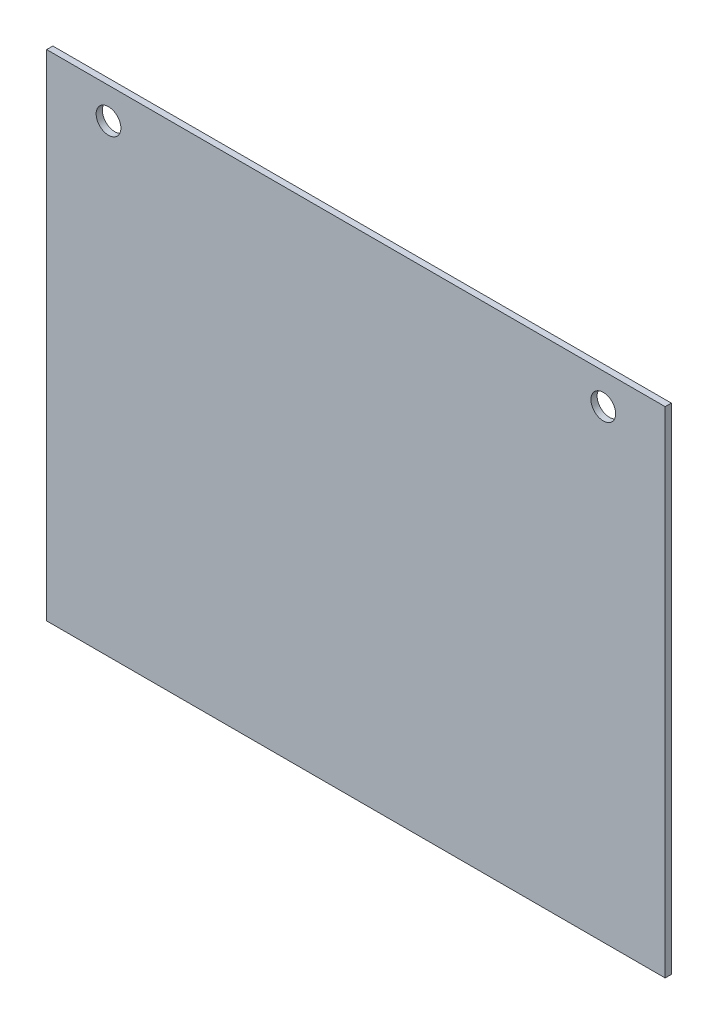
ISO-10303-21;
HEADER;
FILE_DESCRIPTION(('STEP AP214'),'2;1');
FILE_NAME('part.step','',(''),(''),'','','');
FILE_SCHEMA(('AUTOMOTIVE_DESIGN { 1 0 10303 214 1 1 1 1 }'));
ENDSEC;
DATA;
#1=APPLICATION_CONTEXT('core data for automotive mechanical design processes');
#2=APPLICATION_PROTOCOL_DEFINITION('international standard','automotive_design',2000,#1);
#3=PRODUCT_CONTEXT('',#1,'mechanical');
#4=PRODUCT('Part','Part','',(#3));
#5=PRODUCT_RELATED_PRODUCT_CATEGORY('part','',(#4));
#6=PRODUCT_DEFINITION_FORMATION('','',#4);
#7=PRODUCT_DEFINITION_CONTEXT('part definition',#1,'design');
#8=PRODUCT_DEFINITION('design','',#6,#7);
#9=PRODUCT_DEFINITION_SHAPE('','',#8);
#10=(LENGTH_UNIT() NAMED_UNIT(*) SI_UNIT(.MILLI.,.METRE.));
#11=(NAMED_UNIT(*) PLANE_ANGLE_UNIT() SI_UNIT($,.RADIAN.));
#12=(NAMED_UNIT(*) SI_UNIT($,.STERADIAN.) SOLID_ANGLE_UNIT());
#13=UNCERTAINTY_MEASURE_WITH_UNIT(LENGTH_MEASURE(1.E-05),#10,'distance_accuracy_value','');
#14=(GEOMETRIC_REPRESENTATION_CONTEXT(3) GLOBAL_UNCERTAINTY_ASSIGNED_CONTEXT((#13)) GLOBAL_UNIT_ASSIGNED_CONTEXT((#10,
#11,#12)) REPRESENTATION_CONTEXT('',''));
#15=CARTESIAN_POINT('',(0.,0.,0.));
#16=DIRECTION('',(0.,0.,1.));
#17=DIRECTION('',(1.,0.,0.));
#18=AXIS2_PLACEMENT_3D('',#15,#16,#17);
#19=CARTESIAN_POINT('',(-50.,80.,1.));
#20=DIRECTION('',(0.,0.,-1.));
#21=DIRECTION('',(-1.,0.,0.));
#22=AXIS2_PLACEMENT_3D('',#19,#20,#21);
#23=PLANE('',#22);
#24=CARTESIAN_POINT('',(40.,75.,1.));
#25=DIRECTION('',(0.,0.,1.));
#26=DIRECTION('',(1.,0.,0.));
#27=AXIS2_PLACEMENT_3D('',#24,#25,#26);
#28=CIRCLE('',#27,2.);
#29=CARTESIAN_POINT('',(42.,75.,1.));
#30=VERTEX_POINT('',#29);
#31=EDGE_CURVE('E119',#30,#30,#28,.T.);
#32=ORIENTED_EDGE('',*,*,#31,.F.);
#33=EDGE_LOOP('',(#32));
#34=FACE_BOUND('',#33,.T.);
#35=CARTESIAN_POINT('',(-40.,75.,1.));
#36=DIRECTION('',(0.,0.,1.));
#37=DIRECTION('',(1.,0.,0.));
#38=AXIS2_PLACEMENT_3D('',#35,#36,#37);
#39=CIRCLE('',#38,2.);
#40=CARTESIAN_POINT('',(-38.,75.,1.));
#41=VERTEX_POINT('',#40);
#42=EDGE_CURVE('E113',#41,#41,#39,.T.);
#43=ORIENTED_EDGE('',*,*,#42,.F.);
#44=EDGE_LOOP('',(#43));
#45=FACE_BOUND('',#44,.T.);
#46=DIRECTION('',(1.,0.,0.));
#47=VECTOR('',#46,1.);
#48=CARTESIAN_POINT('',(-50.,0.,1.));
#49=LINE('',#48,#47);
#50=CARTESIAN_POINT('',(-50.,0.,1.));
#51=VERTEX_POINT('',#50);
#52=CARTESIAN_POINT('',(50.,0.,1.));
#53=VERTEX_POINT('',#52);
#54=EDGE_CURVE('E101',#51,#53,#49,.T.);
#55=ORIENTED_EDGE('',*,*,#54,.T.);
#56=DIRECTION('',(0.,-1.,0.));
#57=VECTOR('',#56,1.);
#58=CARTESIAN_POINT('',(50.,80.,1.));
#59=LINE('',#58,#57);
#60=CARTESIAN_POINT('',(50.,80.,1.));
#61=VERTEX_POINT('',#60);
#62=EDGE_CURVE('E11',#61,#53,#59,.T.);
#63=ORIENTED_EDGE('',*,*,#62,.F.);
#64=DIRECTION('',(1.,0.,0.));
#65=VECTOR('',#64,1.);
#66=CARTESIAN_POINT('',(-50.,80.,1.));
#67=LINE('',#66,#65);
#68=CARTESIAN_POINT('',(-50.,80.,1.));
#69=VERTEX_POINT('',#68);
#70=EDGE_CURVE('E78',#69,#61,#67,.T.);
#71=ORIENTED_EDGE('',*,*,#70,.F.);
#72=DIRECTION('',(0.,-1.,0.));
#73=VECTOR('',#72,1.);
#74=CARTESIAN_POINT('',(-50.,80.,1.));
#75=LINE('',#74,#73);
#76=EDGE_CURVE('E54',#69,#51,#75,.T.);
#77=ORIENTED_EDGE('',*,*,#76,.T.);
#78=EDGE_LOOP('',(#55,#63,#71,#77));
#79=FACE_BOUND('',#78,.T.);
#80=ADVANCED_FACE('F38',(#34,#45,#79),#23,.F.);
#81=CARTESIAN_POINT('',(50.,80.,0.));
#82=DIRECTION('',(1.,0.,0.));
#83=DIRECTION('',(0.,0.,-1.));
#84=AXIS2_PLACEMENT_3D('',#81,#82,#83);
#85=PLANE('',#84);
#86=DIRECTION('',(0.,0.,1.));
#87=VECTOR('',#86,1.);
#88=CARTESIAN_POINT('',(50.,0.,0.));
#89=LINE('',#88,#87);
#90=CARTESIAN_POINT('',(50.,0.,0.));
#91=VERTEX_POINT('',#90);
#92=EDGE_CURVE('E87',#91,#53,#89,.T.);
#93=ORIENTED_EDGE('',*,*,#92,.F.);
#94=DIRECTION('',(0.,-1.,0.));
#95=VECTOR('',#94,1.);
#96=CARTESIAN_POINT('',(50.,80.,0.));
#97=LINE('',#96,#95);
#98=CARTESIAN_POINT('',(50.,80.,0.));
#99=VERTEX_POINT('',#98);
#100=EDGE_CURVE('E46',#99,#91,#97,.T.);
#101=ORIENTED_EDGE('',*,*,#100,.F.);
#102=DIRECTION('',(0.,0.,1.));
#103=VECTOR('',#102,1.);
#104=CARTESIAN_POINT('',(50.,80.,0.));
#105=LINE('',#104,#103);
#106=EDGE_CURVE('E85',#99,#61,#105,.T.);
#107=ORIENTED_EDGE('',*,*,#106,.T.);
#108=ORIENTED_EDGE('',*,*,#62,.T.);
#109=EDGE_LOOP('',(#93,#101,#107,#108));
#110=FACE_BOUND('',#109,.T.);
#111=ADVANCED_FACE('F84',(#110),#85,.T.);
#112=CARTESIAN_POINT('',(-50.,80.,0.));
#113=DIRECTION('',(0.,0.,-1.));
#114=DIRECTION('',(-1.,0.,0.));
#115=AXIS2_PLACEMENT_3D('',#112,#113,#114);
#116=PLANE('',#115);
#117=CARTESIAN_POINT('',(40.,75.,0.));
#118=DIRECTION('',(0.,0.,1.));
#119=DIRECTION('',(1.,0.,0.));
#120=AXIS2_PLACEMENT_3D('',#117,#118,#119);
#121=CIRCLE('',#120,2.);
#122=CARTESIAN_POINT('',(42.,75.,0.));
#123=VERTEX_POINT('',#122);
#124=EDGE_CURVE('E103',#123,#123,#121,.T.);
#125=ORIENTED_EDGE('',*,*,#124,.T.);
#126=EDGE_LOOP('',(#125));
#127=FACE_BOUND('',#126,.T.);
#128=CARTESIAN_POINT('',(-40.,75.,0.));
#129=DIRECTION('',(0.,0.,1.));
#130=DIRECTION('',(1.,0.,0.));
#131=AXIS2_PLACEMENT_3D('',#128,#129,#130);
#132=CIRCLE('',#131,2.);
#133=CARTESIAN_POINT('',(-38.,75.,0.));
#134=VERTEX_POINT('',#133);
#135=EDGE_CURVE('E116',#134,#134,#132,.T.);
#136=ORIENTED_EDGE('',*,*,#135,.T.);
#137=EDGE_LOOP('',(#136));
#138=FACE_BOUND('',#137,.T.);
#139=DIRECTION('',(1.,0.,0.));
#140=VECTOR('',#139,1.);
#141=CARTESIAN_POINT('',(-50.,0.,0.));
#142=LINE('',#141,#140);
#143=CARTESIAN_POINT('',(-50.,0.,0.));
#144=VERTEX_POINT('',#143);
#145=EDGE_CURVE('E105',#144,#91,#142,.T.);
#146=ORIENTED_EDGE('',*,*,#145,.F.);
#147=DIRECTION('',(0.,-1.,0.));
#148=VECTOR('',#147,1.);
#149=CARTESIAN_POINT('',(-50.,80.,0.));
#150=LINE('',#149,#148);
#151=CARTESIAN_POINT('',(-50.,80.,0.));
#152=VERTEX_POINT('',#151);
#153=EDGE_CURVE('E67',#152,#144,#150,.T.);
#154=ORIENTED_EDGE('',*,*,#153,.F.);
#155=DIRECTION('',(1.,0.,0.));
#156=VECTOR('',#155,1.);
#157=CARTESIAN_POINT('',(-50.,80.,0.));
#158=LINE('',#157,#156);
#159=EDGE_CURVE('E93',#152,#99,#158,.T.);
#160=ORIENTED_EDGE('',*,*,#159,.T.);
#161=ORIENTED_EDGE('',*,*,#100,.T.);
#162=EDGE_LOOP('',(#146,#154,#160,#161));
#163=FACE_BOUND('',#162,.T.);
#164=ADVANCED_FACE('F95',(#127,#138,#163),#116,.T.);
#165=CARTESIAN_POINT('',(-50.,80.,1.));
#166=DIRECTION('',(-1.,0.,0.));
#167=DIRECTION('',(0.,0.,1.));
#168=AXIS2_PLACEMENT_3D('',#165,#166,#167);
#169=PLANE('',#168);
#170=DIRECTION('',(0.,0.,-1.));
#171=VECTOR('',#170,1.);
#172=CARTESIAN_POINT('',(-50.,0.,1.));
#173=LINE('',#172,#171);
#174=EDGE_CURVE('E107',#51,#144,#173,.T.);
#175=ORIENTED_EDGE('',*,*,#174,.F.);
#176=ORIENTED_EDGE('',*,*,#76,.F.);
#177=DIRECTION('',(0.,0.,-1.));
#178=VECTOR('',#177,1.);
#179=CARTESIAN_POINT('',(-50.,80.,1.));
#180=LINE('',#179,#178);
#181=EDGE_CURVE('E96',#69,#152,#180,.T.);
#182=ORIENTED_EDGE('',*,*,#181,.T.);
#183=ORIENTED_EDGE('',*,*,#153,.T.);
#184=EDGE_LOOP('',(#175,#176,#182,#183));
#185=FACE_BOUND('',#184,.T.);
#186=ADVANCED_FACE('F146',(#185),#169,.T.);
#187=CARTESIAN_POINT('',(0.,80.,0.));
#188=DIRECTION('',(0.,-1.,0.));
#189=DIRECTION('',(-1.,0.,0.));
#190=AXIS2_PLACEMENT_3D('',#187,#188,#189);
#191=PLANE('',#190);
#192=ORIENTED_EDGE('',*,*,#70,.T.);
#193=ORIENTED_EDGE('',*,*,#106,.F.);
#194=ORIENTED_EDGE('',*,*,#159,.F.);
#195=ORIENTED_EDGE('',*,*,#181,.F.);
#196=EDGE_LOOP('',(#192,#193,#194,#195));
#197=FACE_BOUND('',#196,.T.);
#198=ADVANCED_FACE('F92',(#197),#191,.F.);
#199=CARTESIAN_POINT('',(0.,0.,0.));
#200=DIRECTION('',(0.,-1.,0.));
#201=DIRECTION('',(-1.,0.,0.));
#202=AXIS2_PLACEMENT_3D('',#199,#200,#201);
#203=PLANE('',#202);
#204=ORIENTED_EDGE('',*,*,#54,.F.);
#205=ORIENTED_EDGE('',*,*,#174,.T.);
#206=ORIENTED_EDGE('',*,*,#145,.T.);
#207=ORIENTED_EDGE('',*,*,#92,.T.);
#208=EDGE_LOOP('',(#204,#205,#206,#207));
#209=FACE_BOUND('',#208,.T.);
#210=ADVANCED_FACE('F137',(#209),#203,.T.);
#211=CARTESIAN_POINT('',(-40.,75.,0.));
#212=DIRECTION('',(0.,0.,1.));
#213=DIRECTION('',(1.,0.,0.));
#214=AXIS2_PLACEMENT_3D('',#211,#212,#213);
#215=CYLINDRICAL_SURFACE('',#214,2.);
#216=ORIENTED_EDGE('',*,*,#135,.F.);
#217=EDGE_LOOP('',(#216));
#218=FACE_BOUND('',#217,.T.);
#219=ORIENTED_EDGE('',*,*,#42,.T.);
#220=EDGE_LOOP('',(#219));
#221=FACE_BOUND('',#220,.T.);
#222=ADVANCED_FACE('F130',(#218,#221),#215,.F.);
#223=CARTESIAN_POINT('',(40.,75.,0.));
#224=DIRECTION('',(0.,0.,1.));
#225=DIRECTION('',(1.,0.,0.));
#226=AXIS2_PLACEMENT_3D('',#223,#224,#225);
#227=CYLINDRICAL_SURFACE('',#226,2.);
#228=ORIENTED_EDGE('',*,*,#124,.F.);
#229=EDGE_LOOP('',(#228));
#230=FACE_BOUND('',#229,.T.);
#231=ORIENTED_EDGE('',*,*,#31,.T.);
#232=EDGE_LOOP('',(#231));
#233=FACE_BOUND('',#232,.T.);
#234=ADVANCED_FACE('F127',(#230,#233),#227,.F.);
#235=CLOSED_SHELL('',(#80,#111,#164,#186,#198,#210,#222,#234));
#236=MANIFOLD_SOLID_BREP('B2',#235);
#237=ADVANCED_BREP_SHAPE_REPRESENTATION('',(#18,#236),#14);
#238=SHAPE_DEFINITION_REPRESENTATION(#9,#237);
ENDSEC;
END-ISO-10303-21;
